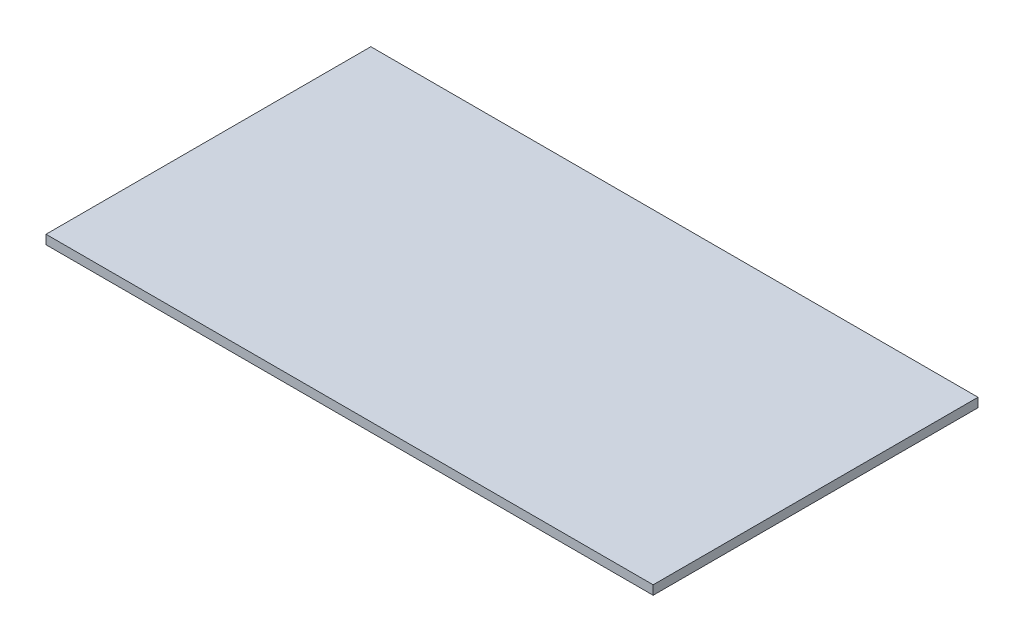
ISO-10303-21;
HEADER;
FILE_DESCRIPTION(('STEP AP214'),'2;1');
FILE_NAME('part.step','',(''),(''),'','','');
FILE_SCHEMA(('AUTOMOTIVE_DESIGN { 1 0 10303 214 1 1 1 1 }'));
ENDSEC;
DATA;
#1=APPLICATION_CONTEXT('core data for automotive mechanical design processes');
#2=APPLICATION_PROTOCOL_DEFINITION('international standard','automotive_design',2000,#1);
#3=PRODUCT_CONTEXT('',#1,'mechanical');
#4=PRODUCT('Part','Part','',(#3));
#5=PRODUCT_RELATED_PRODUCT_CATEGORY('part','',(#4));
#6=PRODUCT_DEFINITION_FORMATION('','',#4);
#7=PRODUCT_DEFINITION_CONTEXT('part definition',#1,'design');
#8=PRODUCT_DEFINITION('design','',#6,#7);
#9=PRODUCT_DEFINITION_SHAPE('','',#8);
#10=(LENGTH_UNIT() NAMED_UNIT(*) SI_UNIT(.MILLI.,.METRE.));
#11=(NAMED_UNIT(*) PLANE_ANGLE_UNIT() SI_UNIT($,.RADIAN.));
#12=(NAMED_UNIT(*) SI_UNIT($,.STERADIAN.) SOLID_ANGLE_UNIT());
#13=UNCERTAINTY_MEASURE_WITH_UNIT(LENGTH_MEASURE(1.E-05),#10,'distance_accuracy_value','');
#14=(GEOMETRIC_REPRESENTATION_CONTEXT(3) GLOBAL_UNCERTAINTY_ASSIGNED_CONTEXT((#13)) GLOBAL_UNIT_ASSIGNED_CONTEXT((#10,
#11,#12)) REPRESENTATION_CONTEXT('',''));
#15=CARTESIAN_POINT('',(0.,0.,0.));
#16=DIRECTION('',(0.,0.,1.));
#17=DIRECTION('',(1.,0.,0.));
#18=AXIS2_PLACEMENT_3D('',#15,#16,#17);
#19=CARTESIAN_POINT('',(500.,15.,267.5));
#20=DIRECTION('',(-1.,0.,0.));
#21=DIRECTION('',(0.,0.,1.));
#22=AXIS2_PLACEMENT_3D('',#19,#20,#21);
#23=PLANE('',#22);
#24=DIRECTION('',(0.,0.,-1.));
#25=VECTOR('',#24,1.);
#26=CARTESIAN_POINT('',(500.,0.,267.5));
#27=LINE('',#26,#25);
#28=CARTESIAN_POINT('',(500.,0.,267.5));
#29=VERTEX_POINT('',#28);
#30=CARTESIAN_POINT('',(500.,0.,-267.5));
#31=VERTEX_POINT('',#30);
#32=EDGE_CURVE('E96',#29,#31,#27,.T.);
#33=ORIENTED_EDGE('',*,*,#32,.T.);
#34=DIRECTION('',(0.,-1.,0.));
#35=VECTOR('',#34,1.);
#36=CARTESIAN_POINT('',(500.,15.,-267.5));
#37=LINE('',#36,#35);
#38=CARTESIAN_POINT('',(500.,15.,-267.5));
#39=VERTEX_POINT('',#38);
#40=EDGE_CURVE('E11',#39,#31,#37,.T.);
#41=ORIENTED_EDGE('',*,*,#40,.F.);
#42=DIRECTION('',(0.,0.,-1.));
#43=VECTOR('',#42,1.);
#44=CARTESIAN_POINT('',(500.,15.,267.5));
#45=LINE('',#44,#43);
#46=CARTESIAN_POINT('',(500.,15.,267.5));
#47=VERTEX_POINT('',#46);
#48=EDGE_CURVE('E84',#47,#39,#45,.T.);
#49=ORIENTED_EDGE('',*,*,#48,.F.);
#50=DIRECTION('',(0.,-1.,0.));
#51=VECTOR('',#50,1.);
#52=CARTESIAN_POINT('',(500.,15.,267.5));
#53=LINE('',#52,#51);
#54=EDGE_CURVE('E92',#47,#29,#53,.T.);
#55=ORIENTED_EDGE('',*,*,#54,.T.);
#56=EDGE_LOOP('',(#33,#41,#49,#55));
#57=FACE_BOUND('',#56,.T.);
#58=ADVANCED_FACE('F33',(#57),#23,.F.);
#59=CARTESIAN_POINT('',(-500.,15.,-267.5));
#60=DIRECTION('',(0.,0.,1.));
#61=DIRECTION('',(1.,0.,0.));
#62=AXIS2_PLACEMENT_3D('',#59,#60,#61);
#63=PLANE('',#62);
#64=DIRECTION('',(-1.,0.,0.));
#65=VECTOR('',#64,1.);
#66=CARTESIAN_POINT('',(-500.,0.,-267.5));
#67=LINE('',#66,#65);
#68=CARTESIAN_POINT('',(-500.,0.,-267.5));
#69=VERTEX_POINT('',#68);
#70=EDGE_CURVE('E88',#31,#69,#67,.T.);
#71=ORIENTED_EDGE('',*,*,#70,.T.);
#72=DIRECTION('',(0.,-1.,0.));
#73=VECTOR('',#72,1.);
#74=CARTESIAN_POINT('',(-500.,15.,-267.5));
#75=LINE('',#74,#73);
#76=CARTESIAN_POINT('',(-500.,15.,-267.5));
#77=VERTEX_POINT('',#76);
#78=EDGE_CURVE('E41',#77,#69,#75,.T.);
#79=ORIENTED_EDGE('',*,*,#78,.F.);
#80=DIRECTION('',(-1.,0.,0.));
#81=VECTOR('',#80,1.);
#82=CARTESIAN_POINT('',(-500.,15.,-267.5));
#83=LINE('',#82,#81);
#84=EDGE_CURVE('E79',#39,#77,#83,.T.);
#85=ORIENTED_EDGE('',*,*,#84,.F.);
#86=ORIENTED_EDGE('',*,*,#40,.T.);
#87=EDGE_LOOP('',(#71,#79,#85,#86));
#88=FACE_BOUND('',#87,.T.);
#89=ADVANCED_FACE('F87',(#88),#63,.F.);
#90=CARTESIAN_POINT('',(-500.,15.,267.5));
#91=DIRECTION('',(1.,0.,0.));
#92=DIRECTION('',(0.,0.,-1.));
#93=AXIS2_PLACEMENT_3D('',#90,#91,#92);
#94=PLANE('',#93);
#95=DIRECTION('',(0.,0.,1.));
#96=VECTOR('',#95,1.);
#97=CARTESIAN_POINT('',(-500.,0.,267.5));
#98=LINE('',#97,#96);
#99=CARTESIAN_POINT('',(-500.,0.,267.5));
#100=VERTEX_POINT('',#99);
#101=EDGE_CURVE('E66',#69,#100,#98,.T.);
#102=ORIENTED_EDGE('',*,*,#101,.T.);
#103=DIRECTION('',(0.,-1.,0.));
#104=VECTOR('',#103,1.);
#105=CARTESIAN_POINT('',(-500.,15.,267.5));
#106=LINE('',#105,#104);
#107=CARTESIAN_POINT('',(-500.,15.,267.5));
#108=VERTEX_POINT('',#107);
#109=EDGE_CURVE('E89',#108,#100,#106,.T.);
#110=ORIENTED_EDGE('',*,*,#109,.F.);
#111=DIRECTION('',(0.,0.,1.));
#112=VECTOR('',#111,1.);
#113=CARTESIAN_POINT('',(-500.,15.,267.5));
#114=LINE('',#113,#112);
#115=EDGE_CURVE('E82',#77,#108,#114,.T.);
#116=ORIENTED_EDGE('',*,*,#115,.F.);
#117=ORIENTED_EDGE('',*,*,#78,.T.);
#118=EDGE_LOOP('',(#102,#110,#116,#117));
#119=FACE_BOUND('',#118,.T.);
#120=ADVANCED_FACE('F90',(#119),#94,.F.);
#121=CARTESIAN_POINT('',(-500.,15.,267.5));
#122=DIRECTION('',(0.,0.,-1.));
#123=DIRECTION('',(-1.,0.,0.));
#124=AXIS2_PLACEMENT_3D('',#121,#122,#123);
#125=PLANE('',#124);
#126=DIRECTION('',(1.,0.,0.));
#127=VECTOR('',#126,1.);
#128=CARTESIAN_POINT('',(-500.,0.,267.5));
#129=LINE('',#128,#127);
#130=EDGE_CURVE('E72',#100,#29,#129,.T.);
#131=ORIENTED_EDGE('',*,*,#130,.T.);
#132=ORIENTED_EDGE('',*,*,#54,.F.);
#133=DIRECTION('',(1.,0.,0.));
#134=VECTOR('',#133,1.);
#135=CARTESIAN_POINT('',(-500.,15.,267.5));
#136=LINE('',#135,#134);
#137=EDGE_CURVE('E49',#108,#47,#136,.T.);
#138=ORIENTED_EDGE('',*,*,#137,.F.);
#139=ORIENTED_EDGE('',*,*,#109,.T.);
#140=EDGE_LOOP('',(#131,#132,#138,#139));
#141=FACE_BOUND('',#140,.T.);
#142=ADVANCED_FACE('F103',(#141),#125,.F.);
#143=CARTESIAN_POINT('',(0.,15.,0.));
#144=DIRECTION('',(0.,-1.,0.));
#145=DIRECTION('',(0.,0.,-1.));
#146=AXIS2_PLACEMENT_3D('',#143,#144,#145);
#147=PLANE('',#146);
#148=ORIENTED_EDGE('',*,*,#48,.T.);
#149=ORIENTED_EDGE('',*,*,#84,.T.);
#150=ORIENTED_EDGE('',*,*,#115,.T.);
#151=ORIENTED_EDGE('',*,*,#137,.T.);
#152=EDGE_LOOP('',(#148,#149,#150,#151));
#153=FACE_BOUND('',#152,.T.);
#154=ADVANCED_FACE('F80',(#153),#147,.F.);
#155=CARTESIAN_POINT('',(0.,0.,0.));
#156=DIRECTION('',(0.,-1.,0.));
#157=DIRECTION('',(0.,0.,-1.));
#158=AXIS2_PLACEMENT_3D('',#155,#156,#157);
#159=PLANE('',#158);
#160=ORIENTED_EDGE('',*,*,#32,.F.);
#161=ORIENTED_EDGE('',*,*,#130,.F.);
#162=ORIENTED_EDGE('',*,*,#101,.F.);
#163=ORIENTED_EDGE('',*,*,#70,.F.);
#164=EDGE_LOOP('',(#160,#161,#162,#163));
#165=FACE_BOUND('',#164,.T.);
#166=ADVANCED_FACE('F106',(#165),#159,.T.);
#167=CLOSED_SHELL('',(#58,#89,#120,#142,#154,#166));
#168=MANIFOLD_SOLID_BREP('B2',#167);
#169=ADVANCED_BREP_SHAPE_REPRESENTATION('',(#18,#168),#14);
#170=SHAPE_DEFINITION_REPRESENTATION(#9,#169);
ENDSEC;
END-ISO-10303-21;
